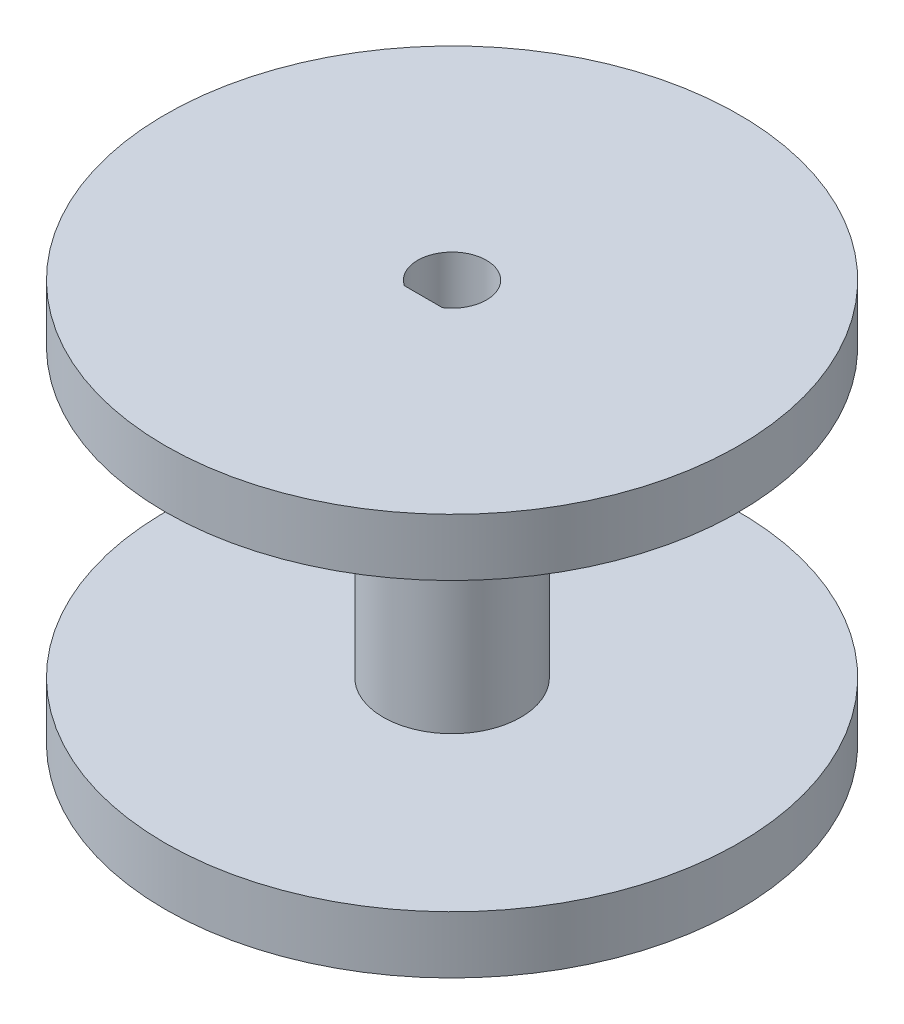
ISO-10303-21;
HEADER;
FILE_DESCRIPTION(('STEP AP214'),'2;1');
FILE_NAME('part.step','',(''),(''),'','','');
FILE_SCHEMA(('AUTOMOTIVE_DESIGN { 1 0 10303 214 1 1 1 1 }'));
ENDSEC;
DATA;
#1=APPLICATION_CONTEXT('core data for automotive mechanical design processes');
#2=APPLICATION_PROTOCOL_DEFINITION('international standard','automotive_design',2000,#1);
#3=PRODUCT_CONTEXT('',#1,'mechanical');
#4=PRODUCT('Part','Part','',(#3));
#5=PRODUCT_RELATED_PRODUCT_CATEGORY('part','',(#4));
#6=PRODUCT_DEFINITION_FORMATION('','',#4);
#7=PRODUCT_DEFINITION_CONTEXT('part definition',#1,'design');
#8=PRODUCT_DEFINITION('design','',#6,#7);
#9=PRODUCT_DEFINITION_SHAPE('','',#8);
#10=(LENGTH_UNIT() NAMED_UNIT(*) SI_UNIT(.MILLI.,.METRE.));
#11=(NAMED_UNIT(*) PLANE_ANGLE_UNIT() SI_UNIT($,.RADIAN.));
#12=(NAMED_UNIT(*) SI_UNIT($,.STERADIAN.) SOLID_ANGLE_UNIT());
#13=UNCERTAINTY_MEASURE_WITH_UNIT(LENGTH_MEASURE(1.E-05),#10,'distance_accuracy_value','');
#14=(GEOMETRIC_REPRESENTATION_CONTEXT(3) GLOBAL_UNCERTAINTY_ASSIGNED_CONTEXT((#13)) GLOBAL_UNIT_ASSIGNED_CONTEXT((#10,
#11,#12)) REPRESENTATION_CONTEXT('',''));
#15=CARTESIAN_POINT('',(0.,0.,0.));
#16=DIRECTION('',(0.,0.,1.));
#17=DIRECTION('',(1.,0.,0.));
#18=AXIS2_PLACEMENT_3D('',#15,#16,#17);
#19=CARTESIAN_POINT('',(0.,5.,0.));
#20=DIRECTION('',(0.,-1.,0.));
#21=DIRECTION('',(0.,0.,-1.));
#22=AXIS2_PLACEMENT_3D('',#19,#20,#21);
#23=CYLINDRICAL_SURFACE('',#22,25.);
#24=CARTESIAN_POINT('',(0.,5.,0.));
#25=DIRECTION('',(0.,1.,0.));
#26=DIRECTION('',(0.,0.,1.));
#27=AXIS2_PLACEMENT_3D('',#24,#25,#26);
#28=CIRCLE('',#27,25.);
#29=CARTESIAN_POINT('',(0.,5.,25.));
#30=VERTEX_POINT('',#29);
#31=EDGE_CURVE('E11',#30,#30,#28,.T.);
#32=ORIENTED_EDGE('',*,*,#31,.F.);
#33=EDGE_LOOP('',(#32));
#34=FACE_BOUND('',#33,.T.);
#35=CARTESIAN_POINT('',(0.,0.,0.));
#36=DIRECTION('',(0.,1.,0.));
#37=DIRECTION('',(0.,0.,1.));
#38=AXIS2_PLACEMENT_3D('',#35,#36,#37);
#39=CIRCLE('',#38,25.);
#40=CARTESIAN_POINT('',(0.,0.,25.));
#41=VERTEX_POINT('',#40);
#42=EDGE_CURVE('E36',#41,#41,#39,.T.);
#43=ORIENTED_EDGE('',*,*,#42,.T.);
#44=EDGE_LOOP('',(#43));
#45=FACE_BOUND('',#44,.T.);
#46=ADVANCED_FACE('F33',(#34,#45),#23,.T.);
#47=CARTESIAN_POINT('',(0.,5.,0.));
#48=DIRECTION('',(0.,1.,0.));
#49=DIRECTION('',(0.,0.,1.));
#50=AXIS2_PLACEMENT_3D('',#47,#48,#49);
#51=PLANE('',#50);
#52=CARTESIAN_POINT('',(0.,5.,0.));
#53=DIRECTION('',(0.,1.,0.));
#54=DIRECTION('',(0.,0.,1.));
#55=AXIS2_PLACEMENT_3D('',#52,#53,#54);
#56=CIRCLE('',#55,6.);
#57=CARTESIAN_POINT('',(0.,5.,6.));
#58=VERTEX_POINT('',#57);
#59=EDGE_CURVE('E82',#58,#58,#56,.T.);
#60=ORIENTED_EDGE('',*,*,#59,.F.);
#61=EDGE_LOOP('',(#60));
#62=FACE_BOUND('',#61,.T.);
#63=ORIENTED_EDGE('',*,*,#31,.T.);
#64=EDGE_LOOP('',(#63));
#65=FACE_BOUND('',#64,.T.);
#66=ADVANCED_FACE('F93',(#62,#65),#51,.T.);
#67=CARTESIAN_POINT('',(0.,0.,0.));
#68=DIRECTION('',(0.,1.,0.));
#69=DIRECTION('',(0.,0.,1.));
#70=AXIS2_PLACEMENT_3D('',#67,#68,#69);
#71=PLANE('',#70);
#72=ORIENTED_EDGE('',*,*,#42,.F.);
#73=EDGE_LOOP('',(#72));
#74=FACE_BOUND('',#73,.T.);
#75=ADVANCED_FACE('F96',(#74),#71,.F.);
#76=CARTESIAN_POINT('',(0.,30.,0.));
#77=DIRECTION('',(0.,-1.,0.));
#78=DIRECTION('',(0.,0.,-1.));
#79=AXIS2_PLACEMENT_3D('',#76,#77,#78);
#80=CYLINDRICAL_SURFACE('',#79,6.);
#81=CARTESIAN_POINT('',(0.,30.,0.));
#82=DIRECTION('',(0.,1.,0.));
#83=DIRECTION('',(0.,0.,1.));
#84=AXIS2_PLACEMENT_3D('',#81,#82,#83);
#85=CIRCLE('',#84,6.);
#86=CARTESIAN_POINT('',(0.,30.,6.));
#87=VERTEX_POINT('',#86);
#88=EDGE_CURVE('E85',#87,#87,#85,.T.);
#89=ORIENTED_EDGE('',*,*,#88,.F.);
#90=EDGE_LOOP('',(#89));
#91=FACE_BOUND('',#90,.T.);
#92=ORIENTED_EDGE('',*,*,#59,.T.);
#93=EDGE_LOOP('',(#92));
#94=FACE_BOUND('',#93,.T.);
#95=ADVANCED_FACE('F91',(#91,#94),#80,.T.);
#96=CARTESIAN_POINT('',(0.,35.,0.));
#97=DIRECTION('',(0.,-1.,0.));
#98=DIRECTION('',(0.,0.,-1.));
#99=AXIS2_PLACEMENT_3D('',#96,#97,#98);
#100=CYLINDRICAL_SURFACE('',#99,25.);
#101=CARTESIAN_POINT('',(0.,35.,0.));
#102=DIRECTION('',(0.,1.,0.));
#103=DIRECTION('',(0.,0.,1.));
#104=AXIS2_PLACEMENT_3D('',#101,#102,#103);
#105=CIRCLE('',#104,25.);
#106=CARTESIAN_POINT('',(0.,35.,25.));
#107=VERTEX_POINT('',#106);
#108=EDGE_CURVE('E79',#107,#107,#105,.T.);
#109=ORIENTED_EDGE('',*,*,#108,.F.);
#110=EDGE_LOOP('',(#109));
#111=FACE_BOUND('',#110,.T.);
#112=CARTESIAN_POINT('',(0.,30.,0.));
#113=DIRECTION('',(0.,1.,0.));
#114=DIRECTION('',(0.,0.,1.));
#115=AXIS2_PLACEMENT_3D('',#112,#113,#114);
#116=CIRCLE('',#115,25.);
#117=CARTESIAN_POINT('',(0.,30.,25.));
#118=VERTEX_POINT('',#117);
#119=EDGE_CURVE('E65',#118,#118,#116,.T.);
#120=ORIENTED_EDGE('',*,*,#119,.T.);
#121=EDGE_LOOP('',(#120));
#122=FACE_BOUND('',#121,.T.);
#123=ADVANCED_FACE('F109',(#111,#122),#100,.T.);
#124=CARTESIAN_POINT('',(0.,35.,0.));
#125=DIRECTION('',(0.,1.,0.));
#126=DIRECTION('',(0.,0.,1.));
#127=AXIS2_PLACEMENT_3D('',#124,#125,#126);
#128=PLANE('',#127);
#129=DIRECTION('',(1.,0.,0.));
#130=VECTOR('',#129,1.);
#131=CARTESIAN_POINT('',(0.,35.,2.5));
#132=LINE('',#131,#130);
#133=CARTESIAN_POINT('',(-1.6583123951777,35.,2.5));
#134=VERTEX_POINT('',#133);
#135=CARTESIAN_POINT('',(1.6583123951777,35.,2.5));
#136=VERTEX_POINT('',#135);
#137=EDGE_CURVE('E62',#134,#136,#132,.T.);
#138=ORIENTED_EDGE('',*,*,#137,.F.);
#139=CARTESIAN_POINT('',(0.,35.,0.));
#140=DIRECTION('',(0.,1.,0.));
#141=DIRECTION('',(0.,0.,1.));
#142=AXIS2_PLACEMENT_3D('',#139,#140,#141);
#143=CIRCLE('',#142,3.);
#144=EDGE_CURVE('E67',#136,#134,#143,.T.);
#145=ORIENTED_EDGE('',*,*,#144,.F.);
#146=EDGE_LOOP('',(#138,#145));
#147=FACE_BOUND('',#146,.T.);
#148=ORIENTED_EDGE('',*,*,#108,.T.);
#149=EDGE_LOOP('',(#148));
#150=FACE_BOUND('',#149,.T.);
#151=ADVANCED_FACE('F71',(#147,#150),#128,.T.);
#152=CARTESIAN_POINT('',(0.,30.,0.));
#153=DIRECTION('',(0.,1.,0.));
#154=DIRECTION('',(0.,0.,1.));
#155=AXIS2_PLACEMENT_3D('',#152,#153,#154);
#156=PLANE('',#155);
#157=ORIENTED_EDGE('',*,*,#88,.T.);
#158=EDGE_LOOP('',(#157));
#159=FACE_BOUND('',#158,.T.);
#160=ORIENTED_EDGE('',*,*,#119,.F.);
#161=EDGE_LOOP('',(#160));
#162=FACE_BOUND('',#161,.T.);
#163=ADVANCED_FACE('F116',(#159,#162),#156,.F.);
#164=CARTESIAN_POINT('',(0.,25.,2.5));
#165=DIRECTION('',(0.,0.,1.));
#166=DIRECTION('',(1.,0.,0.));
#167=AXIS2_PLACEMENT_3D('',#164,#165,#166);
#168=PLANE('',#167);
#169=ORIENTED_EDGE('',*,*,#137,.T.);
#170=DIRECTION('',(0.,1.,0.));
#171=VECTOR('',#170,1.);
#172=CARTESIAN_POINT('',(1.6583123951777,25.,2.5));
#173=LINE('',#172,#171);
#174=CARTESIAN_POINT('',(1.6583123951777,25.,2.5));
#175=VERTEX_POINT('',#174);
#176=EDGE_CURVE('E47',#175,#136,#173,.T.);
#177=ORIENTED_EDGE('',*,*,#176,.F.);
#178=DIRECTION('',(1.,0.,0.));
#179=VECTOR('',#178,1.);
#180=CARTESIAN_POINT('',(0.,25.,2.5));
#181=LINE('',#180,#179);
#182=CARTESIAN_POINT('',(-1.6583123951777,25.,2.5));
#183=VERTEX_POINT('',#182);
#184=EDGE_CURVE('E55',#183,#175,#181,.T.);
#185=ORIENTED_EDGE('',*,*,#184,.F.);
#186=DIRECTION('',(0.,1.,0.));
#187=VECTOR('',#186,1.);
#188=CARTESIAN_POINT('',(-1.6583123951777,25.,2.5));
#189=LINE('',#188,#187);
#190=EDGE_CURVE('E59',#183,#134,#189,.T.);
#191=ORIENTED_EDGE('',*,*,#190,.T.);
#192=EDGE_LOOP('',(#169,#177,#185,#191));
#193=FACE_BOUND('',#192,.T.);
#194=ADVANCED_FACE('F60',(#193),#168,.F.);
#195=CARTESIAN_POINT('',(0.,25.,0.));
#196=DIRECTION('',(0.,1.,0.));
#197=DIRECTION('',(0.,0.,1.));
#198=AXIS2_PLACEMENT_3D('',#195,#196,#197);
#199=CYLINDRICAL_SURFACE('',#198,3.);
#200=ORIENTED_EDGE('',*,*,#144,.T.);
#201=ORIENTED_EDGE('',*,*,#190,.F.);
#202=CARTESIAN_POINT('',(0.,25.,0.));
#203=DIRECTION('',(0.,1.,0.));
#204=DIRECTION('',(0.,0.,1.));
#205=AXIS2_PLACEMENT_3D('',#202,#203,#204);
#206=CIRCLE('',#205,3.);
#207=EDGE_CURVE('E74',#175,#183,#206,.T.);
#208=ORIENTED_EDGE('',*,*,#207,.F.);
#209=ORIENTED_EDGE('',*,*,#176,.T.);
#210=EDGE_LOOP('',(#200,#201,#208,#209));
#211=FACE_BOUND('',#210,.T.);
#212=ADVANCED_FACE('F68',(#211),#199,.F.);
#213=CARTESIAN_POINT('',(0.,25.,0.));
#214=DIRECTION('',(0.,1.,0.));
#215=DIRECTION('',(0.,0.,1.));
#216=AXIS2_PLACEMENT_3D('',#213,#214,#215);
#217=PLANE('',#216);
#218=ORIENTED_EDGE('',*,*,#184,.T.);
#219=ORIENTED_EDGE('',*,*,#207,.T.);
#220=EDGE_LOOP('',(#218,#219));
#221=FACE_BOUND('',#220,.T.);
#222=ADVANCED_FACE('F124',(#221),#217,.T.);
#223=CLOSED_SHELL('',(#46,#66,#75,#95,#123,#151,#163,#194,#212,#222));
#224=MANIFOLD_SOLID_BREP('B2',#223);
#225=ADVANCED_BREP_SHAPE_REPRESENTATION('',(#18,#224),#14);
#226=SHAPE_DEFINITION_REPRESENTATION(#9,#225);
ENDSEC;
END-ISO-10303-21;
